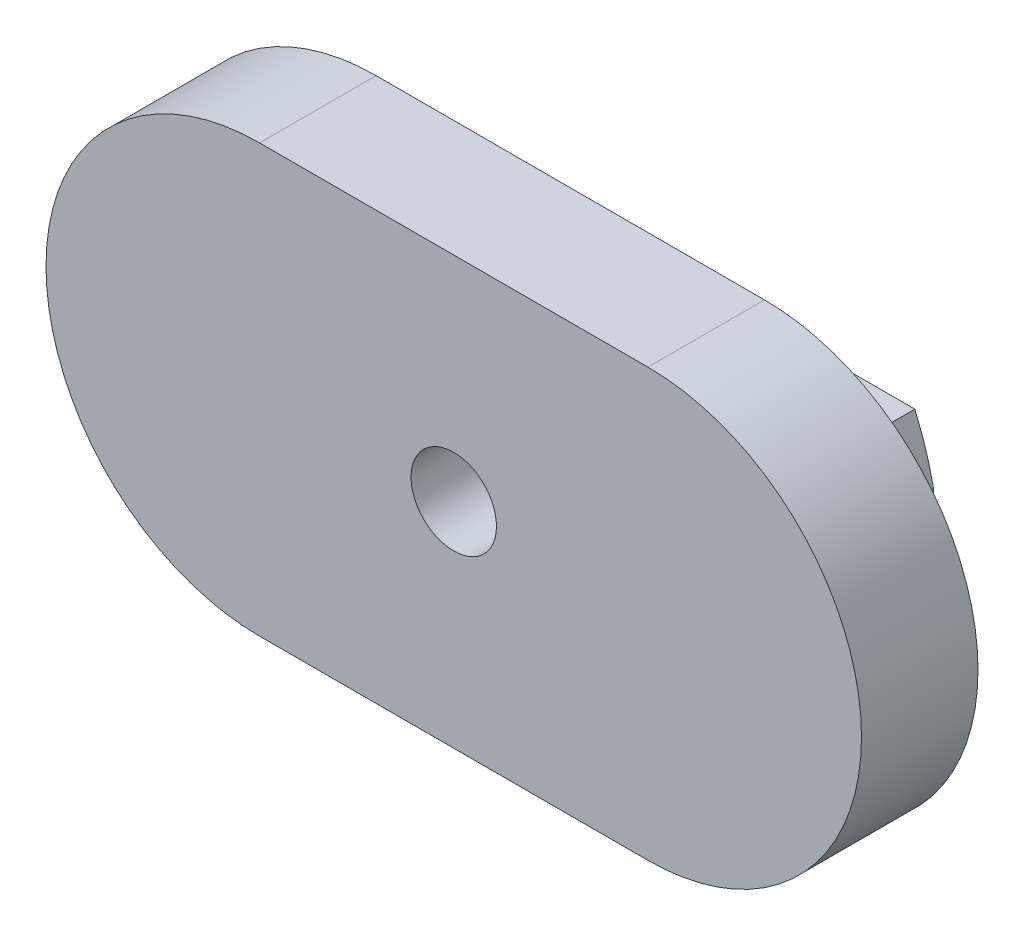
ISO-10303-21;
HEADER;
FILE_DESCRIPTION(('STEP AP214'),'2;1');
FILE_NAME('part.step','',(''),(''),'','','');
FILE_SCHEMA(('AUTOMOTIVE_DESIGN { 1 0 10303 214 1 1 1 1 }'));
ENDSEC;
DATA;
#1=APPLICATION_CONTEXT('core data for automotive mechanical design processes');
#2=APPLICATION_PROTOCOL_DEFINITION('international standard','automotive_design',2000,#1);
#3=PRODUCT_CONTEXT('',#1,'mechanical');
#4=PRODUCT('Part','Part','',(#3));
#5=PRODUCT_RELATED_PRODUCT_CATEGORY('part','',(#4));
#6=PRODUCT_DEFINITION_FORMATION('','',#4);
#7=PRODUCT_DEFINITION_CONTEXT('part definition',#1,'design');
#8=PRODUCT_DEFINITION('design','',#6,#7);
#9=PRODUCT_DEFINITION_SHAPE('','',#8);
#10=(LENGTH_UNIT() NAMED_UNIT(*) SI_UNIT(.MILLI.,.METRE.));
#11=(NAMED_UNIT(*) PLANE_ANGLE_UNIT() SI_UNIT($,.RADIAN.));
#12=(NAMED_UNIT(*) SI_UNIT($,.STERADIAN.) SOLID_ANGLE_UNIT());
#13=UNCERTAINTY_MEASURE_WITH_UNIT(LENGTH_MEASURE(1.E-05),#10,'distance_accuracy_value','');
#14=(GEOMETRIC_REPRESENTATION_CONTEXT(3) GLOBAL_UNCERTAINTY_ASSIGNED_CONTEXT((#13)) GLOBAL_UNIT_ASSIGNED_CONTEXT((#10,
#11,#12)) REPRESENTATION_CONTEXT('',''));
#15=CARTESIAN_POINT('',(0.,0.,0.));
#16=DIRECTION('',(0.,0.,1.));
#17=DIRECTION('',(1.,0.,0.));
#18=AXIS2_PLACEMENT_3D('',#15,#16,#17);
#19=CARTESIAN_POINT('',(-5.,0.,0.));
#20=DIRECTION('',(0.,0.,1.));
#21=DIRECTION('',(1.,0.,0.));
#22=AXIS2_PLACEMENT_3D('',#19,#20,#21);
#23=PLANE('',#22);
#24=CARTESIAN_POINT('',(0.,0.,0.));
#25=DIRECTION('',(0.,0.,-1.));
#26=DIRECTION('',(-1.,0.,0.));
#27=AXIS2_PLACEMENT_3D('',#24,#25,#26);
#28=CIRCLE('',#27,7.5);
#29=CARTESIAN_POINT('',(-7.35410196624968,1.47213595499958,0.));
#30=VERTEX_POINT('',#29);
#31=CARTESIAN_POINT('',(-6.87386354243376,3.,0.));
#32=VERTEX_POINT('',#31);
#33=EDGE_CURVE('E264',#30,#32,#28,.T.);
#34=ORIENTED_EDGE('',*,*,#33,.F.);
#35=DIRECTION('',(0.,1.,0.));
#36=VECTOR('',#35,1.);
#37=CARTESIAN_POINT('',(-7.35410196624968,1.47213595499958,0.));
#38=LINE('',#37,#36);
#39=CARTESIAN_POINT('',(-7.35410196624968,1.,0.));
#40=VERTEX_POINT('',#39);
#41=EDGE_CURVE('E251',#40,#30,#38,.T.);
#42=ORIENTED_EDGE('',*,*,#41,.F.);
#43=DIRECTION('',(-1.,0.,0.));
#44=VECTOR('',#43,1.);
#45=CARTESIAN_POINT('',(-3.35410196624968,1.,0.));
#46=LINE('',#45,#44);
#47=CARTESIAN_POINT('',(-3.35410196624968,1.,0.));
#48=VERTEX_POINT('',#47);
#49=EDGE_CURVE('E254',#48,#40,#46,.T.);
#50=ORIENTED_EDGE('',*,*,#49,.F.);
#51=CARTESIAN_POINT('',(0.,0.,0.));
#52=DIRECTION('',(0.,0.,1.));
#53=DIRECTION('',(1.,0.,0.));
#54=AXIS2_PLACEMENT_3D('',#51,#52,#53);
#55=CIRCLE('',#54,3.5);
#56=CARTESIAN_POINT('',(-1.80277563773199,3.,0.));
#57=VERTEX_POINT('',#56);
#58=EDGE_CURVE('E258',#57,#48,#55,.T.);
#59=ORIENTED_EDGE('',*,*,#58,.F.);
#60=DIRECTION('',(1.,0.,0.));
#61=VECTOR('',#60,1.);
#62=CARTESIAN_POINT('',(-1.80277563773199,3.,0.));
#63=LINE('',#62,#61);
#64=EDGE_CURVE('E261',#32,#57,#63,.T.);
#65=ORIENTED_EDGE('',*,*,#64,.F.);
#66=EDGE_LOOP('',(#34,#42,#50,#59,#65));
#67=FACE_BOUND('',#66,.T.);
#68=CARTESIAN_POINT('',(0.,0.,0.));
#69=DIRECTION('',(0.,0.,1.));
#70=DIRECTION('',(1.,0.,0.));
#71=AXIS2_PLACEMENT_3D('',#68,#69,#70);
#72=CIRCLE('',#71,3.5);
#73=CARTESIAN_POINT('',(1.80277563773199,-3.,0.));
#74=VERTEX_POINT('',#73);
#75=CARTESIAN_POINT('',(3.35410196624969,-0.999999999999999,0.));
#76=VERTEX_POINT('',#75);
#77=EDGE_CURVE('E308',#74,#76,#72,.T.);
#78=ORIENTED_EDGE('',*,*,#77,.F.);
#79=DIRECTION('',(-1.,0.,0.));
#80=VECTOR('',#79,1.);
#81=CARTESIAN_POINT('',(1.80277563773199,-3.,0.));
#82=LINE('',#81,#80);
#83=CARTESIAN_POINT('',(6.87386354243376,-3.,0.));
#84=VERTEX_POINT('',#83);
#85=EDGE_CURVE('E322',#84,#74,#82,.T.);
#86=ORIENTED_EDGE('',*,*,#85,.F.);
#87=CARTESIAN_POINT('',(0.,0.,0.));
#88=DIRECTION('',(0.,0.,-1.));
#89=DIRECTION('',(-1.,0.,0.));
#90=AXIS2_PLACEMENT_3D('',#87,#88,#89);
#91=CIRCLE('',#90,7.5);
#92=CARTESIAN_POINT('',(7.35410196624968,-1.47213595499958,0.));
#93=VERTEX_POINT('',#92);
#94=EDGE_CURVE('E339',#93,#84,#91,.T.);
#95=ORIENTED_EDGE('',*,*,#94,.F.);
#96=DIRECTION('',(0.,-1.,0.));
#97=VECTOR('',#96,1.);
#98=CARTESIAN_POINT('',(7.35410196624968,-1.47213595499958,0.));
#99=LINE('',#98,#97);
#100=CARTESIAN_POINT('',(7.35410196624968,-1.,0.));
#101=VERTEX_POINT('',#100);
#102=EDGE_CURVE('E336',#101,#93,#99,.T.);
#103=ORIENTED_EDGE('',*,*,#102,.F.);
#104=DIRECTION('',(1.,0.,0.));
#105=VECTOR('',#104,1.);
#106=CARTESIAN_POINT('',(3.35410196624968,-0.999999999999999,0.));
#107=LINE('',#106,#105);
#108=EDGE_CURVE('E333',#76,#101,#107,.T.);
#109=ORIENTED_EDGE('',*,*,#108,.F.);
#110=EDGE_LOOP('',(#78,#86,#95,#103,#109));
#111=FACE_BOUND('',#110,.T.);
#112=CARTESIAN_POINT('',(-5.,0.,0.));
#113=DIRECTION('',(0.,0.,1.));
#114=DIRECTION('',(1.,0.,0.));
#115=AXIS2_PLACEMENT_3D('',#112,#113,#114);
#116=CIRCLE('',#115,5.5);
#117=CARTESIAN_POINT('',(-5.,5.5,0.));
#118=VERTEX_POINT('',#117);
#119=CARTESIAN_POINT('',(-5.,-5.5,0.));
#120=VERTEX_POINT('',#119);
#121=EDGE_CURVE('E362',#118,#120,#116,.T.);
#122=ORIENTED_EDGE('',*,*,#121,.F.);
#123=DIRECTION('',(-1.,0.,0.));
#124=VECTOR('',#123,1.);
#125=CARTESIAN_POINT('',(-5.,5.5,0.));
#126=LINE('',#125,#124);
#127=CARTESIAN_POINT('',(5.,5.5,0.));
#128=VERTEX_POINT('',#127);
#129=EDGE_CURVE('E369',#128,#118,#126,.T.);
#130=ORIENTED_EDGE('',*,*,#129,.F.);
#131=CARTESIAN_POINT('',(5.,0.,0.));
#132=DIRECTION('',(0.,0.,1.));
#133=DIRECTION('',(1.,0.,0.));
#134=AXIS2_PLACEMENT_3D('',#131,#132,#133);
#135=CIRCLE('',#134,5.5);
#136=CARTESIAN_POINT('',(5.,-5.5,0.));
#137=VERTEX_POINT('',#136);
#138=EDGE_CURVE('E380',#137,#128,#135,.T.);
#139=ORIENTED_EDGE('',*,*,#138,.F.);
#140=DIRECTION('',(1.,0.,0.));
#141=VECTOR('',#140,1.);
#142=CARTESIAN_POINT('',(-5.,-5.5,0.));
#143=LINE('',#142,#141);
#144=EDGE_CURVE('E378',#120,#137,#143,.T.);
#145=ORIENTED_EDGE('',*,*,#144,.F.);
#146=EDGE_LOOP('',(#122,#130,#139,#145));
#147=FACE_BOUND('',#146,.T.);
#148=CARTESIAN_POINT('',(0.,0.,0.));
#149=DIRECTION('',(0.,0.,1.));
#150=DIRECTION('',(1.,0.,0.));
#151=AXIS2_PLACEMENT_3D('',#148,#149,#150);
#152=CIRCLE('',#151,1.1);
#153=CARTESIAN_POINT('',(1.1,0.,0.));
#154=VERTEX_POINT('',#153);
#155=EDGE_CURVE('E358',#154,#154,#152,.T.);
#156=ORIENTED_EDGE('',*,*,#155,.T.);
#157=EDGE_LOOP('',(#156));
#158=FACE_BOUND('',#157,.T.);
#159=CARTESIAN_POINT('',(0.,0.,0.));
#160=DIRECTION('',(0.,0.,1.));
#161=DIRECTION('',(-1.,0.,0.));
#162=AXIS2_PLACEMENT_3D('',#159,#160,#161);
#163=CIRCLE('',#162,3.5);
#164=CARTESIAN_POINT('',(3.35410196624968,1.,0.));
#165=VERTEX_POINT('',#164);
#166=CARTESIAN_POINT('',(1.80277563773199,3.,0.));
#167=VERTEX_POINT('',#166);
#168=EDGE_CURVE('E305',#165,#167,#163,.T.);
#169=ORIENTED_EDGE('',*,*,#168,.F.);
#170=DIRECTION('',(-1.,0.,0.));
#171=VECTOR('',#170,1.);
#172=CARTESIAN_POINT('',(3.35410196624968,1.,0.));
#173=LINE('',#172,#171);
#174=CARTESIAN_POINT('',(7.35410196624969,1.,0.));
#175=VERTEX_POINT('',#174);
#176=EDGE_CURVE('E292',#175,#165,#173,.T.);
#177=ORIENTED_EDGE('',*,*,#176,.F.);
#178=DIRECTION('',(0.,-1.,0.));
#179=VECTOR('',#178,1.);
#180=CARTESIAN_POINT('',(7.35410196624968,1.47213595499958,0.));
#181=LINE('',#180,#179);
#182=CARTESIAN_POINT('',(7.35410196624968,1.47213595499958,0.));
#183=VERTEX_POINT('',#182);
#184=EDGE_CURVE('E295',#183,#175,#181,.T.);
#185=ORIENTED_EDGE('',*,*,#184,.F.);
#186=CARTESIAN_POINT('',(0.,0.,0.));
#187=DIRECTION('',(0.,0.,-1.));
#188=DIRECTION('',(-1.,0.,0.));
#189=AXIS2_PLACEMENT_3D('',#186,#187,#188);
#190=CIRCLE('',#189,7.5);
#191=CARTESIAN_POINT('',(6.87386354243376,3.,0.));
#192=VERTEX_POINT('',#191);
#193=EDGE_CURVE('E299',#192,#183,#190,.T.);
#194=ORIENTED_EDGE('',*,*,#193,.F.);
#195=DIRECTION('',(1.,0.,0.));
#196=VECTOR('',#195,1.);
#197=CARTESIAN_POINT('',(1.80277563773199,3.,0.));
#198=LINE('',#197,#196);
#199=EDGE_CURVE('E302',#167,#192,#198,.T.);
#200=ORIENTED_EDGE('',*,*,#199,.F.);
#201=EDGE_LOOP('',(#169,#177,#185,#194,#200));
#202=FACE_BOUND('',#201,.T.);
#203=CARTESIAN_POINT('',(0.,0.,0.));
#204=DIRECTION('',(0.,0.,-1.));
#205=DIRECTION('',(-1.,0.,0.));
#206=AXIS2_PLACEMENT_3D('',#203,#204,#205);
#207=CIRCLE('',#206,7.5);
#208=CARTESIAN_POINT('',(-6.87386354243376,-3.,0.));
#209=VERTEX_POINT('',#208);
#210=CARTESIAN_POINT('',(-7.35410196624968,-1.47213595499958,0.));
#211=VERTEX_POINT('',#210);
#212=EDGE_CURVE('E196',#209,#211,#207,.T.);
#213=ORIENTED_EDGE('',*,*,#212,.F.);
#214=DIRECTION('',(-1.,0.,0.));
#215=VECTOR('',#214,1.);
#216=CARTESIAN_POINT('',(-1.802775637732,-3.,0.));
#217=LINE('',#216,#215);
#218=CARTESIAN_POINT('',(-1.802775637732,-3.,0.));
#219=VERTEX_POINT('',#218);
#220=EDGE_CURVE('E198',#219,#209,#217,.T.);
#221=ORIENTED_EDGE('',*,*,#220,.F.);
#222=CARTESIAN_POINT('',(0.,0.,0.));
#223=DIRECTION('',(0.,0.,1.));
#224=DIRECTION('',(-1.,0.,0.));
#225=AXIS2_PLACEMENT_3D('',#222,#223,#224);
#226=CIRCLE('',#225,3.5);
#227=CARTESIAN_POINT('',(-3.35410196624969,-0.999999999999997,0.));
#228=VERTEX_POINT('',#227);
#229=EDGE_CURVE('E214',#228,#219,#226,.T.);
#230=ORIENTED_EDGE('',*,*,#229,.F.);
#231=DIRECTION('',(1.,0.,0.));
#232=VECTOR('',#231,1.);
#233=CARTESIAN_POINT('',(-3.35410196624969,-0.999999999999997,0.));
#234=LINE('',#233,#232);
#235=CARTESIAN_POINT('',(-7.35410196624968,-0.999999999999996,0.));
#236=VERTEX_POINT('',#235);
#237=EDGE_CURVE('E59',#236,#228,#234,.T.);
#238=ORIENTED_EDGE('',*,*,#237,.F.);
#239=DIRECTION('',(0.,1.,0.));
#240=VECTOR('',#239,1.);
#241=CARTESIAN_POINT('',(-7.35410196624968,-1.47213595499958,0.));
#242=LINE('',#241,#240);
#243=EDGE_CURVE('E54',#211,#236,#242,.T.);
#244=ORIENTED_EDGE('',*,*,#243,.F.);
#245=EDGE_LOOP('',(#213,#221,#230,#238,#244));
#246=FACE_BOUND('',#245,.T.);
#247=ADVANCED_FACE('F39',(#67,#111,#147,#158,#202,#246),#23,.F.);
#248=CARTESIAN_POINT('',(-5.,0.,3.));
#249=DIRECTION('',(0.,0.,1.));
#250=DIRECTION('',(1.,0.,0.));
#251=AXIS2_PLACEMENT_3D('',#248,#249,#250);
#252=PLANE('',#251);
#253=CARTESIAN_POINT('',(-5.,0.,3.));
#254=DIRECTION('',(0.,0.,1.));
#255=DIRECTION('',(1.,0.,0.));
#256=AXIS2_PLACEMENT_3D('',#253,#254,#255);
#257=CIRCLE('',#256,5.5);
#258=CARTESIAN_POINT('',(-5.,5.5,3.));
#259=VERTEX_POINT('',#258);
#260=CARTESIAN_POINT('',(-5.,-5.5,3.));
#261=VERTEX_POINT('',#260);
#262=EDGE_CURVE('E365',#259,#261,#257,.T.);
#263=ORIENTED_EDGE('',*,*,#262,.T.);
#264=DIRECTION('',(1.,0.,0.));
#265=VECTOR('',#264,1.);
#266=CARTESIAN_POINT('',(-5.,-5.5,3.));
#267=LINE('',#266,#265);
#268=CARTESIAN_POINT('',(5.,-5.5,3.));
#269=VERTEX_POINT('',#268);
#270=EDGE_CURVE('E368',#261,#269,#267,.T.);
#271=ORIENTED_EDGE('',*,*,#270,.T.);
#272=CARTESIAN_POINT('',(5.,0.,3.));
#273=DIRECTION('',(0.,0.,1.));
#274=DIRECTION('',(1.,0.,0.));
#275=AXIS2_PLACEMENT_3D('',#272,#273,#274);
#276=CIRCLE('',#275,5.5);
#277=CARTESIAN_POINT('',(5.,5.5,3.));
#278=VERTEX_POINT('',#277);
#279=EDGE_CURVE('E371',#269,#278,#276,.T.);
#280=ORIENTED_EDGE('',*,*,#279,.T.);
#281=DIRECTION('',(-1.,0.,0.));
#282=VECTOR('',#281,1.);
#283=CARTESIAN_POINT('',(-5.,5.5,3.));
#284=LINE('',#283,#282);
#285=EDGE_CURVE('E373',#278,#259,#284,.T.);
#286=ORIENTED_EDGE('',*,*,#285,.T.);
#287=EDGE_LOOP('',(#263,#271,#280,#286));
#288=FACE_BOUND('',#287,.T.);
#289=CARTESIAN_POINT('',(0.,0.,3.));
#290=DIRECTION('',(0.,0.,1.));
#291=DIRECTION('',(1.,0.,0.));
#292=AXIS2_PLACEMENT_3D('',#289,#290,#291);
#293=CIRCLE('',#292,1.1);
#294=CARTESIAN_POINT('',(1.1,0.,3.));
#295=VERTEX_POINT('',#294);
#296=EDGE_CURVE('E359',#295,#295,#293,.T.);
#297=ORIENTED_EDGE('',*,*,#296,.F.);
#298=EDGE_LOOP('',(#297));
#299=FACE_BOUND('',#298,.T.);
#300=ADVANCED_FACE('F407',(#288,#299),#252,.T.);
#301=CARTESIAN_POINT('',(-5.,0.,3.));
#302=DIRECTION('',(0.,0.,-1.));
#303=DIRECTION('',(-1.,0.,0.));
#304=AXIS2_PLACEMENT_3D('',#301,#302,#303);
#305=CYLINDRICAL_SURFACE('',#304,5.5);
#306=ORIENTED_EDGE('',*,*,#121,.T.);
#307=DIRECTION('',(0.,0.,-1.));
#308=VECTOR('',#307,1.);
#309=CARTESIAN_POINT('',(-5.,-5.5,3.));
#310=LINE('',#309,#308);
#311=EDGE_CURVE('E11',#261,#120,#310,.T.);
#312=ORIENTED_EDGE('',*,*,#311,.F.);
#313=ORIENTED_EDGE('',*,*,#262,.F.);
#314=DIRECTION('',(0.,0.,-1.));
#315=VECTOR('',#314,1.);
#316=CARTESIAN_POINT('',(-5.,5.5,3.));
#317=LINE('',#316,#315);
#318=EDGE_CURVE('E375',#259,#118,#317,.T.);
#319=ORIENTED_EDGE('',*,*,#318,.T.);
#320=EDGE_LOOP('',(#306,#312,#313,#319));
#321=FACE_BOUND('',#320,.T.);
#322=ADVANCED_FACE('F41',(#321),#305,.T.);
#323=CARTESIAN_POINT('',(-5.,-5.5,3.));
#324=DIRECTION('',(0.,1.,0.));
#325=DIRECTION('',(-1.,0.,0.));
#326=AXIS2_PLACEMENT_3D('',#323,#324,#325);
#327=PLANE('',#326);
#328=ORIENTED_EDGE('',*,*,#144,.T.);
#329=DIRECTION('',(0.,0.,-1.));
#330=VECTOR('',#329,1.);
#331=CARTESIAN_POINT('',(5.,-5.5,3.));
#332=LINE('',#331,#330);
#333=EDGE_CURVE('E47',#269,#137,#332,.T.);
#334=ORIENTED_EDGE('',*,*,#333,.F.);
#335=ORIENTED_EDGE('',*,*,#270,.F.);
#336=ORIENTED_EDGE('',*,*,#311,.T.);
#337=EDGE_LOOP('',(#328,#334,#335,#336));
#338=FACE_BOUND('',#337,.T.);
#339=ADVANCED_FACE('F409',(#338),#327,.F.);
#340=CARTESIAN_POINT('',(5.,0.,3.));
#341=DIRECTION('',(0.,0.,-1.));
#342=DIRECTION('',(-1.,0.,0.));
#343=AXIS2_PLACEMENT_3D('',#340,#341,#342);
#344=CYLINDRICAL_SURFACE('',#343,5.5);
#345=ORIENTED_EDGE('',*,*,#138,.T.);
#346=DIRECTION('',(0.,0.,-1.));
#347=VECTOR('',#346,1.);
#348=CARTESIAN_POINT('',(5.,5.5,3.));
#349=LINE('',#348,#347);
#350=EDGE_CURVE('E385',#278,#128,#349,.T.);
#351=ORIENTED_EDGE('',*,*,#350,.F.);
#352=ORIENTED_EDGE('',*,*,#279,.F.);
#353=ORIENTED_EDGE('',*,*,#333,.T.);
#354=EDGE_LOOP('',(#345,#351,#352,#353));
#355=FACE_BOUND('',#354,.T.);
#356=ADVANCED_FACE('F392',(#355),#344,.T.);
#357=CARTESIAN_POINT('',(-5.,5.5,3.));
#358=DIRECTION('',(0.,-1.,0.));
#359=DIRECTION('',(1.,0.,0.));
#360=AXIS2_PLACEMENT_3D('',#357,#358,#359);
#361=PLANE('',#360);
#362=ORIENTED_EDGE('',*,*,#129,.T.);
#363=ORIENTED_EDGE('',*,*,#318,.F.);
#364=ORIENTED_EDGE('',*,*,#285,.F.);
#365=ORIENTED_EDGE('',*,*,#350,.T.);
#366=EDGE_LOOP('',(#362,#363,#364,#365));
#367=FACE_BOUND('',#366,.T.);
#368=ADVANCED_FACE('F401',(#367),#361,.F.);
#369=CARTESIAN_POINT('',(0.,0.,3.));
#370=DIRECTION('',(0.,0.,-1.));
#371=DIRECTION('',(-1.,0.,0.));
#372=AXIS2_PLACEMENT_3D('',#369,#370,#371);
#373=CYLINDRICAL_SURFACE('',#372,1.1);
#374=ORIENTED_EDGE('',*,*,#296,.T.);
#375=EDGE_LOOP('',(#374));
#376=FACE_BOUND('',#375,.T.);
#377=ORIENTED_EDGE('',*,*,#155,.F.);
#378=EDGE_LOOP('',(#377));
#379=FACE_BOUND('',#378,.T.);
#380=ADVANCED_FACE('F427',(#376,#379),#373,.F.);
#381=CARTESIAN_POINT('',(0.,0.,-2.));
#382=DIRECTION('',(0.,0.,1.));
#383=DIRECTION('',(1.,0.,0.));
#384=AXIS2_PLACEMENT_3D('',#381,#382,#383);
#385=CYLINDRICAL_SURFACE('',#384,3.5);
#386=ORIENTED_EDGE('',*,*,#77,.T.);
#387=DIRECTION('',(0.,0.,1.));
#388=VECTOR('',#387,1.);
#389=CARTESIAN_POINT('',(3.35410196624968,-0.999999999999999,-2.));
#390=LINE('',#389,#388);
#391=CARTESIAN_POINT('',(3.35410196624968,-0.999999999999999,-2.));
#392=VERTEX_POINT('',#391);
#393=EDGE_CURVE('E355',#392,#76,#390,.T.);
#394=ORIENTED_EDGE('',*,*,#393,.F.);
#395=CARTESIAN_POINT('',(0.,0.,-2.));
#396=DIRECTION('',(0.,0.,1.));
#397=DIRECTION('',(1.,0.,0.));
#398=AXIS2_PLACEMENT_3D('',#395,#396,#397);
#399=CIRCLE('',#398,3.5);
#400=CARTESIAN_POINT('',(1.80277563773199,-3.,-2.));
#401=VERTEX_POINT('',#400);
#402=EDGE_CURVE('E318',#401,#392,#399,.T.);
#403=ORIENTED_EDGE('',*,*,#402,.F.);
#404=DIRECTION('',(0.,0.,1.));
#405=VECTOR('',#404,1.);
#406=CARTESIAN_POINT('',(1.80277563773199,-3.,-2.));
#407=LINE('',#406,#405);
#408=EDGE_CURVE('E330',#401,#74,#407,.T.);
#409=ORIENTED_EDGE('',*,*,#408,.T.);
#410=EDGE_LOOP('',(#386,#394,#403,#409));
#411=FACE_BOUND('',#410,.T.);
#412=ADVANCED_FACE('F431',(#411),#385,.F.);
#413=CARTESIAN_POINT('',(3.35410196624968,-0.999999999999999,-2.));
#414=DIRECTION('',(0.,-1.,0.));
#415=DIRECTION('',(1.,0.,0.));
#416=AXIS2_PLACEMENT_3D('',#413,#414,#415);
#417=PLANE('',#416);
#418=ORIENTED_EDGE('',*,*,#108,.T.);
#419=DIRECTION('',(0.,0.,1.));
#420=VECTOR('',#419,1.);
#421=CARTESIAN_POINT('',(7.35410196624968,-1.,-2.));
#422=LINE('',#421,#420);
#423=CARTESIAN_POINT('',(7.35410196624968,-1.,-2.));
#424=VERTEX_POINT('',#423);
#425=EDGE_CURVE('E352',#424,#101,#422,.T.);
#426=ORIENTED_EDGE('',*,*,#425,.F.);
#427=DIRECTION('',(1.,0.,0.));
#428=VECTOR('',#427,1.);
#429=CARTESIAN_POINT('',(3.35410196624968,-0.999999999999999,-2.));
#430=LINE('',#429,#428);
#431=EDGE_CURVE('E321',#392,#424,#430,.T.);
#432=ORIENTED_EDGE('',*,*,#431,.F.);
#433=ORIENTED_EDGE('',*,*,#393,.T.);
#434=EDGE_LOOP('',(#418,#426,#432,#433));
#435=FACE_BOUND('',#434,.T.);
#436=ADVANCED_FACE('F436',(#435),#417,.F.);
#437=CARTESIAN_POINT('',(7.35410196624968,-1.47213595499958,-2.));
#438=DIRECTION('',(-1.,0.,0.));
#439=DIRECTION('',(0.,0.,1.));
#440=AXIS2_PLACEMENT_3D('',#437,#438,#439);
#441=PLANE('',#440);
#442=ORIENTED_EDGE('',*,*,#102,.T.);
#443=DIRECTION('',(0.,0.,1.));
#444=VECTOR('',#443,1.);
#445=CARTESIAN_POINT('',(7.35410196624968,-1.47213595499958,-2.));
#446=LINE('',#445,#444);
#447=CARTESIAN_POINT('',(7.35410196624968,-1.47213595499958,-2.));
#448=VERTEX_POINT('',#447);
#449=EDGE_CURVE('E349',#448,#93,#446,.T.);
#450=ORIENTED_EDGE('',*,*,#449,.F.);
#451=DIRECTION('',(0.,-1.,0.));
#452=VECTOR('',#451,1.);
#453=CARTESIAN_POINT('',(7.35410196624968,-1.47213595499958,-2.));
#454=LINE('',#453,#452);
#455=EDGE_CURVE('E324',#424,#448,#454,.T.);
#456=ORIENTED_EDGE('',*,*,#455,.F.);
#457=ORIENTED_EDGE('',*,*,#425,.T.);
#458=EDGE_LOOP('',(#442,#450,#456,#457));
#459=FACE_BOUND('',#458,.T.);
#460=ADVANCED_FACE('F443',(#459),#441,.F.);
#461=CARTESIAN_POINT('',(0.,0.,-2.));
#462=DIRECTION('',(0.,0.,1.));
#463=DIRECTION('',(1.,0.,0.));
#464=AXIS2_PLACEMENT_3D('',#461,#462,#463);
#465=CYLINDRICAL_SURFACE('',#464,7.5);
#466=ORIENTED_EDGE('',*,*,#94,.T.);
#467=DIRECTION('',(0.,0.,1.));
#468=VECTOR('',#467,1.);
#469=CARTESIAN_POINT('',(6.87386354243376,-3.,-2.));
#470=LINE('',#469,#468);
#471=CARTESIAN_POINT('',(6.87386354243376,-3.,-2.));
#472=VERTEX_POINT('',#471);
#473=EDGE_CURVE('E346',#472,#84,#470,.T.);
#474=ORIENTED_EDGE('',*,*,#473,.F.);
#475=CARTESIAN_POINT('',(0.,0.,-2.));
#476=DIRECTION('',(0.,0.,-1.));
#477=DIRECTION('',(-1.,0.,0.));
#478=AXIS2_PLACEMENT_3D('',#475,#476,#477);
#479=CIRCLE('',#478,7.5);
#480=EDGE_CURVE('E326',#448,#472,#479,.T.);
#481=ORIENTED_EDGE('',*,*,#480,.F.);
#482=ORIENTED_EDGE('',*,*,#449,.T.);
#483=EDGE_LOOP('',(#466,#474,#481,#482));
#484=FACE_BOUND('',#483,.T.);
#485=ADVANCED_FACE('F447',(#484),#465,.T.);
#486=CARTESIAN_POINT('',(1.80277563773199,-3.,-2.));
#487=DIRECTION('',(0.,1.,0.));
#488=DIRECTION('',(-1.,0.,0.));
#489=AXIS2_PLACEMENT_3D('',#486,#487,#488);
#490=PLANE('',#489);
#491=ORIENTED_EDGE('',*,*,#85,.T.);
#492=ORIENTED_EDGE('',*,*,#408,.F.);
#493=DIRECTION('',(-1.,0.,0.));
#494=VECTOR('',#493,1.);
#495=CARTESIAN_POINT('',(1.80277563773199,-3.,-2.));
#496=LINE('',#495,#494);
#497=EDGE_CURVE('E328',#472,#401,#496,.T.);
#498=ORIENTED_EDGE('',*,*,#497,.F.);
#499=ORIENTED_EDGE('',*,*,#473,.T.);
#500=EDGE_LOOP('',(#491,#492,#498,#499));
#501=FACE_BOUND('',#500,.T.);
#502=ADVANCED_FACE('F451',(#501),#490,.F.);
#503=CARTESIAN_POINT('',(0.,0.,-2.));
#504=DIRECTION('',(0.,0.,1.));
#505=DIRECTION('',(1.,0.,0.));
#506=AXIS2_PLACEMENT_3D('',#503,#504,#505);
#507=PLANE('',#506);
#508=ORIENTED_EDGE('',*,*,#402,.T.);
#509=ORIENTED_EDGE('',*,*,#431,.T.);
#510=ORIENTED_EDGE('',*,*,#455,.T.);
#511=ORIENTED_EDGE('',*,*,#480,.T.);
#512=ORIENTED_EDGE('',*,*,#497,.T.);
#513=EDGE_LOOP('',(#508,#509,#510,#511,#512));
#514=FACE_BOUND('',#513,.T.);
#515=ADVANCED_FACE('F455',(#514),#507,.F.);
#516=CARTESIAN_POINT('',(0.,0.,-2.));
#517=DIRECTION('',(0.,0.,1.));
#518=DIRECTION('',(1.,0.,0.));
#519=AXIS2_PLACEMENT_3D('',#516,#517,#518);
#520=CYLINDRICAL_SURFACE('',#519,3.5);
#521=ORIENTED_EDGE('',*,*,#168,.T.);
#522=DIRECTION('',(0.,0.,1.));
#523=VECTOR('',#522,1.);
#524=CARTESIAN_POINT('',(1.80277563773199,3.,-2.));
#525=LINE('',#524,#523);
#526=CARTESIAN_POINT('',(1.80277563773199,3.,-2.));
#527=VERTEX_POINT('',#526);
#528=EDGE_CURVE('E267',#527,#167,#525,.T.);
#529=ORIENTED_EDGE('',*,*,#528,.F.);
#530=CARTESIAN_POINT('',(0.,0.,-2.));
#531=DIRECTION('',(0.,0.,1.));
#532=DIRECTION('',(-1.,0.,0.));
#533=AXIS2_PLACEMENT_3D('',#530,#531,#532);
#534=CIRCLE('',#533,3.5);
#535=CARTESIAN_POINT('',(3.35410196624968,1.,-2.));
#536=VERTEX_POINT('',#535);
#537=EDGE_CURVE('E296',#536,#527,#534,.T.);
#538=ORIENTED_EDGE('',*,*,#537,.F.);
#539=DIRECTION('',(0.,0.,1.));
#540=VECTOR('',#539,1.);
#541=CARTESIAN_POINT('',(3.35410196624968,1.,-2.));
#542=LINE('',#541,#540);
#543=EDGE_CURVE('E288',#536,#165,#542,.T.);
#544=ORIENTED_EDGE('',*,*,#543,.T.);
#545=EDGE_LOOP('',(#521,#529,#538,#544));
#546=FACE_BOUND('',#545,.T.);
#547=ADVANCED_FACE('F459',(#546),#520,.F.);
#548=CARTESIAN_POINT('',(1.80277563773199,3.,-2.));
#549=DIRECTION('',(0.,-1.,0.));
#550=DIRECTION('',(1.,0.,0.));
#551=AXIS2_PLACEMENT_3D('',#548,#549,#550);
#552=PLANE('',#551);
#553=ORIENTED_EDGE('',*,*,#199,.T.);
#554=DIRECTION('',(0.,0.,1.));
#555=VECTOR('',#554,1.);
#556=CARTESIAN_POINT('',(6.87386354243376,3.,-2.));
#557=LINE('',#556,#555);
#558=CARTESIAN_POINT('',(6.87386354243376,3.,-2.));
#559=VERTEX_POINT('',#558);
#560=EDGE_CURVE('E279',#559,#192,#557,.T.);
#561=ORIENTED_EDGE('',*,*,#560,.F.);
#562=DIRECTION('',(1.,0.,0.));
#563=VECTOR('',#562,1.);
#564=CARTESIAN_POINT('',(1.80277563773199,3.,-2.));
#565=LINE('',#564,#563);
#566=EDGE_CURVE('E314',#527,#559,#565,.T.);
#567=ORIENTED_EDGE('',*,*,#566,.F.);
#568=ORIENTED_EDGE('',*,*,#528,.T.);
#569=EDGE_LOOP('',(#553,#561,#567,#568));
#570=FACE_BOUND('',#569,.T.);
#571=ADVANCED_FACE('F477',(#570),#552,.F.);
#572=CARTESIAN_POINT('',(0.,0.,-2.));
#573=DIRECTION('',(0.,0.,1.));
#574=DIRECTION('',(1.,0.,0.));
#575=AXIS2_PLACEMENT_3D('',#572,#573,#574);
#576=CYLINDRICAL_SURFACE('',#575,7.5);
#577=ORIENTED_EDGE('',*,*,#193,.T.);
#578=DIRECTION('',(0.,0.,1.));
#579=VECTOR('',#578,1.);
#580=CARTESIAN_POINT('',(7.35410196624968,1.47213595499958,-2.));
#581=LINE('',#580,#579);
#582=CARTESIAN_POINT('',(7.35410196624968,1.47213595499958,-2.));
#583=VERTEX_POINT('',#582);
#584=EDGE_CURVE('E282',#583,#183,#581,.T.);
#585=ORIENTED_EDGE('',*,*,#584,.F.);
#586=CARTESIAN_POINT('',(0.,0.,-2.));
#587=DIRECTION('',(0.,0.,-1.));
#588=DIRECTION('',(-1.,0.,0.));
#589=AXIS2_PLACEMENT_3D('',#586,#587,#588);
#590=CIRCLE('',#589,7.5);
#591=EDGE_CURVE('E312',#559,#583,#590,.T.);
#592=ORIENTED_EDGE('',*,*,#591,.F.);
#593=ORIENTED_EDGE('',*,*,#560,.T.);
#594=EDGE_LOOP('',(#577,#585,#592,#593));
#595=FACE_BOUND('',#594,.T.);
#596=ADVANCED_FACE('F473',(#595),#576,.T.);
#597=CARTESIAN_POINT('',(7.35410196624968,1.47213595499958,-2.));
#598=DIRECTION('',(-1.,0.,0.));
#599=DIRECTION('',(0.,0.,1.));
#600=AXIS2_PLACEMENT_3D('',#597,#598,#599);
#601=PLANE('',#600);
#602=ORIENTED_EDGE('',*,*,#184,.T.);
#603=DIRECTION('',(0.,0.,1.));
#604=VECTOR('',#603,1.);
#605=CARTESIAN_POINT('',(7.35410196624968,1.,-2.));
#606=LINE('',#605,#604);
#607=CARTESIAN_POINT('',(7.35410196624968,1.,-2.));
#608=VERTEX_POINT('',#607);
#609=EDGE_CURVE('E285',#608,#175,#606,.T.);
#610=ORIENTED_EDGE('',*,*,#609,.F.);
#611=DIRECTION('',(0.,-1.,0.));
#612=VECTOR('',#611,1.);
#613=CARTESIAN_POINT('',(7.35410196624968,1.47213595499958,-2.));
#614=LINE('',#613,#612);
#615=EDGE_CURVE('E310',#583,#608,#614,.T.);
#616=ORIENTED_EDGE('',*,*,#615,.F.);
#617=ORIENTED_EDGE('',*,*,#584,.T.);
#618=EDGE_LOOP('',(#602,#610,#616,#617));
#619=FACE_BOUND('',#618,.T.);
#620=ADVANCED_FACE('F469',(#619),#601,.F.);
#621=CARTESIAN_POINT('',(3.35410196624968,1.,-2.));
#622=DIRECTION('',(0.,1.,0.));
#623=DIRECTION('',(-1.,0.,0.));
#624=AXIS2_PLACEMENT_3D('',#621,#622,#623);
#625=PLANE('',#624);
#626=ORIENTED_EDGE('',*,*,#176,.T.);
#627=ORIENTED_EDGE('',*,*,#543,.F.);
#628=DIRECTION('',(-1.,0.,0.));
#629=VECTOR('',#628,1.);
#630=CARTESIAN_POINT('',(3.35410196624968,1.,-2.));
#631=LINE('',#630,#629);
#632=EDGE_CURVE('E291',#608,#536,#631,.T.);
#633=ORIENTED_EDGE('',*,*,#632,.F.);
#634=ORIENTED_EDGE('',*,*,#609,.T.);
#635=EDGE_LOOP('',(#626,#627,#633,#634));
#636=FACE_BOUND('',#635,.T.);
#637=ADVANCED_FACE('F465',(#636),#625,.F.);
#638=CARTESIAN_POINT('',(0.,0.,-2.));
#639=DIRECTION('',(0.,0.,-1.));
#640=DIRECTION('',(-1.,0.,0.));
#641=AXIS2_PLACEMENT_3D('',#638,#639,#640);
#642=PLANE('',#641);
#643=ORIENTED_EDGE('',*,*,#537,.T.);
#644=ORIENTED_EDGE('',*,*,#566,.T.);
#645=ORIENTED_EDGE('',*,*,#591,.T.);
#646=ORIENTED_EDGE('',*,*,#615,.T.);
#647=ORIENTED_EDGE('',*,*,#632,.T.);
#648=EDGE_LOOP('',(#643,#644,#645,#646,#647));
#649=FACE_BOUND('',#648,.T.);
#650=ADVANCED_FACE('F461',(#649),#642,.T.);
#651=CARTESIAN_POINT('',(0.,0.,-2.));
#652=DIRECTION('',(0.,0.,1.));
#653=DIRECTION('',(1.,0.,0.));
#654=AXIS2_PLACEMENT_3D('',#651,#652,#653);
#655=CYLINDRICAL_SURFACE('',#654,7.5);
#656=ORIENTED_EDGE('',*,*,#33,.T.);
#657=DIRECTION('',(0.,0.,1.));
#658=VECTOR('',#657,1.);
#659=CARTESIAN_POINT('',(-6.87386354243376,3.,-2.));
#660=LINE('',#659,#658);
#661=CARTESIAN_POINT('',(-6.87386354243376,3.,-2.));
#662=VERTEX_POINT('',#661);
#663=EDGE_CURVE('E203',#662,#32,#660,.T.);
#664=ORIENTED_EDGE('',*,*,#663,.F.);
#665=CARTESIAN_POINT('',(0.,0.,-2.));
#666=DIRECTION('',(0.,0.,-1.));
#667=DIRECTION('',(-1.,0.,0.));
#668=AXIS2_PLACEMENT_3D('',#665,#666,#667);
#669=CIRCLE('',#668,7.5);
#670=CARTESIAN_POINT('',(-7.35410196624968,1.47213595499958,-2.));
#671=VERTEX_POINT('',#670);
#672=EDGE_CURVE('E255',#671,#662,#669,.T.);
#673=ORIENTED_EDGE('',*,*,#672,.F.);
#674=DIRECTION('',(0.,0.,1.));
#675=VECTOR('',#674,1.);
#676=CARTESIAN_POINT('',(-7.35410196624968,1.47213595499958,-2.));
#677=LINE('',#676,#675);
#678=EDGE_CURVE('E247',#671,#30,#677,.T.);
#679=ORIENTED_EDGE('',*,*,#678,.T.);
#680=EDGE_LOOP('',(#656,#664,#673,#679));
#681=FACE_BOUND('',#680,.T.);
#682=ADVANCED_FACE('F464',(#681),#655,.T.);
#683=CARTESIAN_POINT('',(-1.80277563773199,3.,-2.));
#684=DIRECTION('',(0.,-1.,0.));
#685=DIRECTION('',(1.,0.,0.));
#686=AXIS2_PLACEMENT_3D('',#683,#684,#685);
#687=PLANE('',#686);
#688=ORIENTED_EDGE('',*,*,#64,.T.);
#689=DIRECTION('',(0.,0.,1.));
#690=VECTOR('',#689,1.);
#691=CARTESIAN_POINT('',(-1.80277563773199,3.,-2.));
#692=LINE('',#691,#690);
#693=CARTESIAN_POINT('',(-1.80277563773199,3.,-2.));
#694=VERTEX_POINT('',#693);
#695=EDGE_CURVE('E238',#694,#57,#692,.T.);
#696=ORIENTED_EDGE('',*,*,#695,.F.);
#697=DIRECTION('',(1.,0.,0.));
#698=VECTOR('',#697,1.);
#699=CARTESIAN_POINT('',(-1.80277563773199,3.,-2.));
#700=LINE('',#699,#698);
#701=EDGE_CURVE('E273',#662,#694,#700,.T.);
#702=ORIENTED_EDGE('',*,*,#701,.F.);
#703=ORIENTED_EDGE('',*,*,#663,.T.);
#704=EDGE_LOOP('',(#688,#696,#702,#703));
#705=FACE_BOUND('',#704,.T.);
#706=ADVANCED_FACE('F500',(#705),#687,.F.);
#707=CARTESIAN_POINT('',(0.,0.,-2.));
#708=DIRECTION('',(0.,0.,1.));
#709=DIRECTION('',(1.,0.,0.));
#710=AXIS2_PLACEMENT_3D('',#707,#708,#709);
#711=CYLINDRICAL_SURFACE('',#710,3.5);
#712=ORIENTED_EDGE('',*,*,#58,.T.);
#713=DIRECTION('',(0.,0.,1.));
#714=VECTOR('',#713,1.);
#715=CARTESIAN_POINT('',(-3.35410196624968,1.,-2.));
#716=LINE('',#715,#714);
#717=CARTESIAN_POINT('',(-3.35410196624968,1.,-2.));
#718=VERTEX_POINT('',#717);
#719=EDGE_CURVE('E241',#718,#48,#716,.T.);
#720=ORIENTED_EDGE('',*,*,#719,.F.);
#721=CARTESIAN_POINT('',(0.,0.,-2.));
#722=DIRECTION('',(0.,0.,1.));
#723=DIRECTION('',(1.,0.,0.));
#724=AXIS2_PLACEMENT_3D('',#721,#722,#723);
#725=CIRCLE('',#724,3.5);
#726=EDGE_CURVE('E271',#694,#718,#725,.T.);
#727=ORIENTED_EDGE('',*,*,#726,.F.);
#728=ORIENTED_EDGE('',*,*,#695,.T.);
#729=EDGE_LOOP('',(#712,#720,#727,#728));
#730=FACE_BOUND('',#729,.T.);
#731=ADVANCED_FACE('F496',(#730),#711,.F.);
#732=CARTESIAN_POINT('',(-3.35410196624968,1.,-2.));
#733=DIRECTION('',(0.,1.,0.));
#734=DIRECTION('',(-1.,0.,0.));
#735=AXIS2_PLACEMENT_3D('',#732,#733,#734);
#736=PLANE('',#735);
#737=ORIENTED_EDGE('',*,*,#49,.T.);
#738=DIRECTION('',(0.,0.,1.));
#739=VECTOR('',#738,1.);
#740=CARTESIAN_POINT('',(-7.35410196624968,1.,-2.));
#741=LINE('',#740,#739);
#742=CARTESIAN_POINT('',(-7.35410196624968,1.,-2.));
#743=VERTEX_POINT('',#742);
#744=EDGE_CURVE('E244',#743,#40,#741,.T.);
#745=ORIENTED_EDGE('',*,*,#744,.F.);
#746=DIRECTION('',(-1.,0.,0.));
#747=VECTOR('',#746,1.);
#748=CARTESIAN_POINT('',(-3.35410196624968,1.,-2.));
#749=LINE('',#748,#747);
#750=EDGE_CURVE('E269',#718,#743,#749,.T.);
#751=ORIENTED_EDGE('',*,*,#750,.F.);
#752=ORIENTED_EDGE('',*,*,#719,.T.);
#753=EDGE_LOOP('',(#737,#745,#751,#752));
#754=FACE_BOUND('',#753,.T.);
#755=ADVANCED_FACE('F492',(#754),#736,.F.);
#756=CARTESIAN_POINT('',(-7.35410196624968,1.47213595499958,-2.));
#757=DIRECTION('',(1.,0.,0.));
#758=DIRECTION('',(0.,0.,-1.));
#759=AXIS2_PLACEMENT_3D('',#756,#757,#758);
#760=PLANE('',#759);
#761=ORIENTED_EDGE('',*,*,#41,.T.);
#762=ORIENTED_EDGE('',*,*,#678,.F.);
#763=DIRECTION('',(0.,1.,0.));
#764=VECTOR('',#763,1.);
#765=CARTESIAN_POINT('',(-7.35410196624968,1.47213595499958,-2.));
#766=LINE('',#765,#764);
#767=EDGE_CURVE('E250',#743,#671,#766,.T.);
#768=ORIENTED_EDGE('',*,*,#767,.F.);
#769=ORIENTED_EDGE('',*,*,#744,.T.);
#770=EDGE_LOOP('',(#761,#762,#768,#769));
#771=FACE_BOUND('',#770,.T.);
#772=ADVANCED_FACE('F488',(#771),#760,.F.);
#773=CARTESIAN_POINT('',(0.,0.,-2.));
#774=DIRECTION('',(0.,0.,-1.));
#775=DIRECTION('',(-1.,0.,0.));
#776=AXIS2_PLACEMENT_3D('',#773,#774,#775);
#777=PLANE('',#776);
#778=ORIENTED_EDGE('',*,*,#672,.T.);
#779=ORIENTED_EDGE('',*,*,#701,.T.);
#780=ORIENTED_EDGE('',*,*,#726,.T.);
#781=ORIENTED_EDGE('',*,*,#750,.T.);
#782=ORIENTED_EDGE('',*,*,#767,.T.);
#783=EDGE_LOOP('',(#778,#779,#780,#781,#782));
#784=FACE_BOUND('',#783,.T.);
#785=ADVANCED_FACE('F485',(#784),#777,.T.);
#786=CARTESIAN_POINT('',(0.,0.,-2.));
#787=DIRECTION('',(0.,0.,1.));
#788=DIRECTION('',(1.,0.,0.));
#789=AXIS2_PLACEMENT_3D('',#786,#787,#788);
#790=CYLINDRICAL_SURFACE('',#789,7.5);
#791=ORIENTED_EDGE('',*,*,#212,.T.);
#792=DIRECTION('',(0.,0.,1.));
#793=VECTOR('',#792,1.);
#794=CARTESIAN_POINT('',(-7.35410196624968,-1.47213595499958,-2.));
#795=LINE('',#794,#793);
#796=CARTESIAN_POINT('',(-7.35410196624968,-1.47213595499958,-2.));
#797=VERTEX_POINT('',#796);
#798=EDGE_CURVE('E771',#797,#211,#795,.T.);
#799=ORIENTED_EDGE('',*,*,#798,.F.);
#800=CARTESIAN_POINT('',(0.,0.,-2.));
#801=DIRECTION('',(0.,0.,-1.));
#802=DIRECTION('',(-1.,0.,0.));
#803=AXIS2_PLACEMENT_3D('',#800,#801,#802);
#804=CIRCLE('',#803,7.5);
#805=CARTESIAN_POINT('',(-6.87386354243376,-3.,-2.));
#806=VERTEX_POINT('',#805);
#807=EDGE_CURVE('E215',#806,#797,#804,.T.);
#808=ORIENTED_EDGE('',*,*,#807,.F.);
#809=DIRECTION('',(0.,0.,1.));
#810=VECTOR('',#809,1.);
#811=CARTESIAN_POINT('',(-6.87386354243376,-3.,-2.));
#812=LINE('',#811,#810);
#813=EDGE_CURVE('E210',#806,#209,#812,.T.);
#814=ORIENTED_EDGE('',*,*,#813,.T.);
#815=EDGE_LOOP('',(#791,#799,#808,#814));
#816=FACE_BOUND('',#815,.T.);
#817=ADVANCED_FACE('F217',(#816),#790,.T.);
#818=CARTESIAN_POINT('',(-7.35410196624968,-1.47213595499958,-2.));
#819=DIRECTION('',(1.,0.,0.));
#820=DIRECTION('',(0.,0.,-1.));
#821=AXIS2_PLACEMENT_3D('',#818,#819,#820);
#822=PLANE('',#821);
#823=ORIENTED_EDGE('',*,*,#243,.T.);
#824=DIRECTION('',(0.,0.,1.));
#825=VECTOR('',#824,1.);
#826=CARTESIAN_POINT('',(-7.35410196624968,-0.999999999999996,-2.));
#827=LINE('',#826,#825);
#828=CARTESIAN_POINT('',(-7.35410196624968,-0.999999999999996,-2.));
#829=VERTEX_POINT('',#828);
#830=EDGE_CURVE('E769',#829,#236,#827,.T.);
#831=ORIENTED_EDGE('',*,*,#830,.F.);
#832=DIRECTION('',(0.,1.,0.));
#833=VECTOR('',#832,1.);
#834=CARTESIAN_POINT('',(-7.35410196624968,-1.47213595499958,-2.));
#835=LINE('',#834,#833);
#836=EDGE_CURVE('E233',#797,#829,#835,.T.);
#837=ORIENTED_EDGE('',*,*,#836,.F.);
#838=ORIENTED_EDGE('',*,*,#798,.T.);
#839=EDGE_LOOP('',(#823,#831,#837,#838));
#840=FACE_BOUND('',#839,.T.);
#841=ADVANCED_FACE('F521',(#840),#822,.F.);
#842=CARTESIAN_POINT('',(-3.35410196624969,-0.999999999999997,-2.));
#843=DIRECTION('',(0.,-1.,0.));
#844=DIRECTION('',(1.,0.,0.));
#845=AXIS2_PLACEMENT_3D('',#842,#843,#844);
#846=PLANE('',#845);
#847=ORIENTED_EDGE('',*,*,#237,.T.);
#848=DIRECTION('',(0.,0.,1.));
#849=VECTOR('',#848,1.);
#850=CARTESIAN_POINT('',(-3.35410196624969,-0.999999999999997,-2.));
#851=LINE('',#850,#849);
#852=CARTESIAN_POINT('',(-3.35410196624969,-0.999999999999997,-2.));
#853=VERTEX_POINT('',#852);
#854=EDGE_CURVE('E223',#853,#228,#851,.T.);
#855=ORIENTED_EDGE('',*,*,#854,.F.);
#856=DIRECTION('',(1.,0.,0.));
#857=VECTOR('',#856,1.);
#858=CARTESIAN_POINT('',(-3.35410196624969,-0.999999999999997,-2.));
#859=LINE('',#858,#857);
#860=EDGE_CURVE('E231',#829,#853,#859,.T.);
#861=ORIENTED_EDGE('',*,*,#860,.F.);
#862=ORIENTED_EDGE('',*,*,#830,.T.);
#863=EDGE_LOOP('',(#847,#855,#861,#862));
#864=FACE_BOUND('',#863,.T.);
#865=ADVANCED_FACE('F517',(#864),#846,.F.);
#866=CARTESIAN_POINT('',(0.,0.,-2.));
#867=DIRECTION('',(0.,0.,1.));
#868=DIRECTION('',(1.,0.,0.));
#869=AXIS2_PLACEMENT_3D('',#866,#867,#868);
#870=CYLINDRICAL_SURFACE('',#869,3.5);
#871=ORIENTED_EDGE('',*,*,#229,.T.);
#872=DIRECTION('',(0.,0.,1.));
#873=VECTOR('',#872,1.);
#874=CARTESIAN_POINT('',(-1.802775637732,-3.,-2.));
#875=LINE('',#874,#873);
#876=CARTESIAN_POINT('',(-1.802775637732,-3.,-2.));
#877=VERTEX_POINT('',#876);
#878=EDGE_CURVE('E213',#877,#219,#875,.T.);
#879=ORIENTED_EDGE('',*,*,#878,.F.);
#880=CARTESIAN_POINT('',(0.,0.,-2.));
#881=DIRECTION('',(0.,0.,1.));
#882=DIRECTION('',(-1.,0.,0.));
#883=AXIS2_PLACEMENT_3D('',#880,#881,#882);
#884=CIRCLE('',#883,3.5);
#885=EDGE_CURVE('E221',#853,#877,#884,.T.);
#886=ORIENTED_EDGE('',*,*,#885,.F.);
#887=ORIENTED_EDGE('',*,*,#854,.T.);
#888=EDGE_LOOP('',(#871,#879,#886,#887));
#889=FACE_BOUND('',#888,.T.);
#890=ADVANCED_FACE('F514',(#889),#870,.F.);
#891=CARTESIAN_POINT('',(-1.802775637732,-3.,-2.));
#892=DIRECTION('',(0.,1.,0.));
#893=DIRECTION('',(-1.,0.,0.));
#894=AXIS2_PLACEMENT_3D('',#891,#892,#893);
#895=PLANE('',#894);
#896=ORIENTED_EDGE('',*,*,#220,.T.);
#897=ORIENTED_EDGE('',*,*,#813,.F.);
#898=DIRECTION('',(-1.,0.,0.));
#899=VECTOR('',#898,1.);
#900=CARTESIAN_POINT('',(-1.802775637732,-3.,-2.));
#901=LINE('',#900,#899);
#902=EDGE_CURVE('E219',#877,#806,#901,.T.);
#903=ORIENTED_EDGE('',*,*,#902,.F.);
#904=ORIENTED_EDGE('',*,*,#878,.T.);
#905=EDGE_LOOP('',(#896,#897,#903,#904));
#906=FACE_BOUND('',#905,.T.);
#907=ADVANCED_FACE('F208',(#906),#895,.F.);
#908=CARTESIAN_POINT('',(0.,0.,-2.));
#909=DIRECTION('',(0.,0.,-1.));
#910=DIRECTION('',(-1.,0.,0.));
#911=AXIS2_PLACEMENT_3D('',#908,#909,#910);
#912=PLANE('',#911);
#913=ORIENTED_EDGE('',*,*,#807,.T.);
#914=ORIENTED_EDGE('',*,*,#836,.T.);
#915=ORIENTED_EDGE('',*,*,#860,.T.);
#916=ORIENTED_EDGE('',*,*,#885,.T.);
#917=ORIENTED_EDGE('',*,*,#902,.T.);
#918=EDGE_LOOP('',(#913,#914,#915,#916,#917));
#919=FACE_BOUND('',#918,.T.);
#920=ADVANCED_FACE('F508',(#919),#912,.T.);
#921=CLOSED_SHELL('',(#247,#300,#322,#339,#356,#368,#380,#412,#436,#460,#485,#502,#515,#547,
#571,#596,#620,#637,#650,#682,#706,#731,#755,#772,#785,#817,#841,#865,#890,#907,#920));
#922=MANIFOLD_SOLID_BREP('B2',#921);
#923=ADVANCED_BREP_SHAPE_REPRESENTATION('',(#18,#922),#14);
#924=SHAPE_DEFINITION_REPRESENTATION(#9,#923);
ENDSEC;
END-ISO-10303-21;
